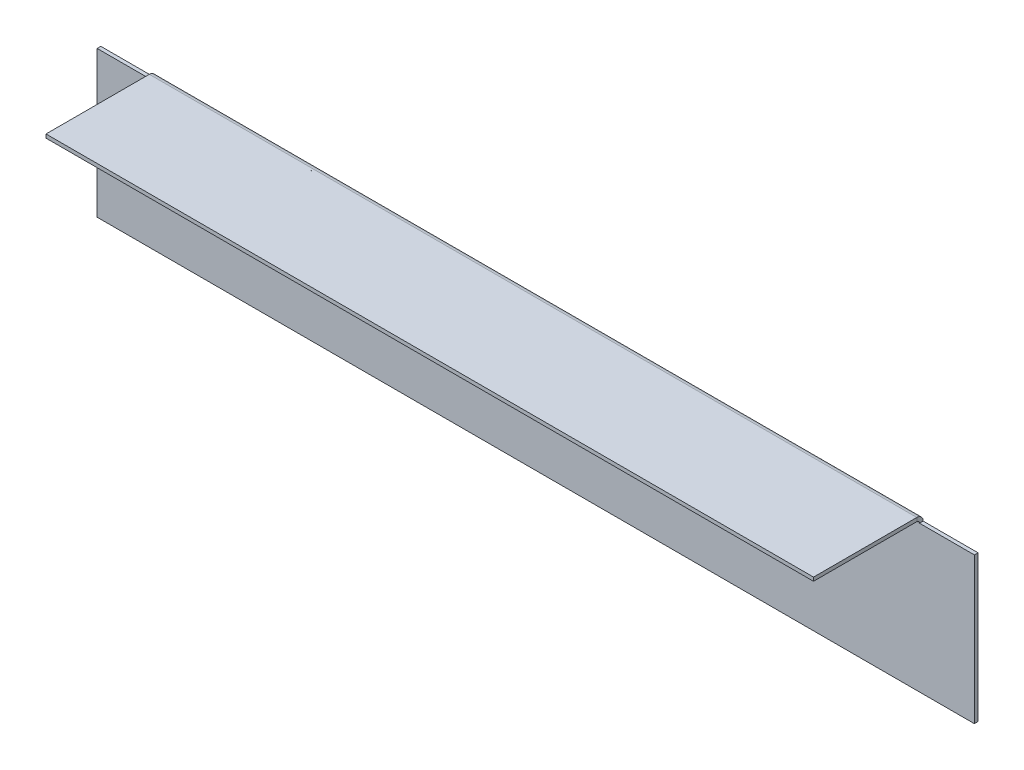
ISO-10303-21;
HEADER;
FILE_DESCRIPTION(('STEP AP214'),'2;1');
FILE_NAME('part.step','',(''),(''),'','','');
FILE_SCHEMA(('AUTOMOTIVE_DESIGN { 1 0 10303 214 1 1 1 1 }'));
ENDSEC;
DATA;
#1=APPLICATION_CONTEXT('core data for automotive mechanical design processes');
#2=APPLICATION_PROTOCOL_DEFINITION('international standard','automotive_design',2000,#1);
#3=PRODUCT_CONTEXT('',#1,'mechanical');
#4=PRODUCT('Part','Part','',(#3));
#5=PRODUCT_RELATED_PRODUCT_CATEGORY('part','',(#4));
#6=PRODUCT_DEFINITION_FORMATION('','',#4);
#7=PRODUCT_DEFINITION_CONTEXT('part definition',#1,'design');
#8=PRODUCT_DEFINITION('design','',#6,#7);
#9=PRODUCT_DEFINITION_SHAPE('','',#8);
#10=(LENGTH_UNIT() NAMED_UNIT(*) SI_UNIT(.MILLI.,.METRE.));
#11=(NAMED_UNIT(*) PLANE_ANGLE_UNIT() SI_UNIT($,.RADIAN.));
#12=(NAMED_UNIT(*) SI_UNIT($,.STERADIAN.) SOLID_ANGLE_UNIT());
#13=UNCERTAINTY_MEASURE_WITH_UNIT(LENGTH_MEASURE(1.E-05),#10,'distance_accuracy_value','');
#14=(GEOMETRIC_REPRESENTATION_CONTEXT(3) GLOBAL_UNCERTAINTY_ASSIGNED_CONTEXT((#13)) GLOBAL_UNIT_ASSIGNED_CONTEXT((#10,
#11,#12)) REPRESENTATION_CONTEXT('',''));
#15=CARTESIAN_POINT('',(0.,0.,0.));
#16=DIRECTION('',(0.,0.,1.));
#17=DIRECTION('',(1.,0.,0.));
#18=AXIS2_PLACEMENT_3D('',#15,#16,#17);
#19=CARTESIAN_POINT('',(-120.,20.,-1.));
#20=DIRECTION('',(0.,1.,0.));
#21=DIRECTION('',(0.,0.,1.));
#22=AXIS2_PLACEMENT_3D('',#19,#20,#21);
#23=PLANE('',#22);
#24=DIRECTION('',(-1.,0.,0.));
#25=VECTOR('',#24,1.);
#26=CARTESIAN_POINT('',(-120.,20.,0.));
#27=LINE('',#26,#25);
#28=CARTESIAN_POINT('',(-105.,20.,0.));
#29=VERTEX_POINT('',#28);
#30=CARTESIAN_POINT('',(-120.,20.,0.));
#31=VERTEX_POINT('',#30);
#32=EDGE_CURVE('E240',#29,#31,#27,.T.);
#33=ORIENTED_EDGE('',*,*,#32,.F.);
#34=DIRECTION('',(0.,0.,-1.));
#35=VECTOR('',#34,1.);
#36=CARTESIAN_POINT('',(-105.,20.,0.));
#37=LINE('',#36,#35);
#38=CARTESIAN_POINT('',(-105.,20.,-1.));
#39=VERTEX_POINT('',#38);
#40=EDGE_CURVE('E203',#29,#39,#37,.T.);
#41=ORIENTED_EDGE('',*,*,#40,.T.);
#42=DIRECTION('',(-1.,0.,0.));
#43=VECTOR('',#42,1.);
#44=CARTESIAN_POINT('',(-120.,20.,-1.));
#45=LINE('',#44,#43);
#46=CARTESIAN_POINT('',(-120.,20.,-1.));
#47=VERTEX_POINT('',#46);
#48=EDGE_CURVE('E271',#39,#47,#45,.T.);
#49=ORIENTED_EDGE('',*,*,#48,.T.);
#50=DIRECTION('',(0.,0.,1.));
#51=VECTOR('',#50,1.);
#52=CARTESIAN_POINT('',(-120.,20.,-1.));
#53=LINE('',#52,#51);
#54=EDGE_CURVE('E257',#47,#31,#53,.T.);
#55=ORIENTED_EDGE('',*,*,#54,.T.);
#56=EDGE_LOOP('',(#33,#41,#49,#55));
#57=FACE_BOUND('',#56,.T.);
#58=ADVANCED_FACE('F57',(#57),#23,.T.);
#59=CARTESIAN_POINT('',(120.,-20.,-1.));
#60=DIRECTION('',(1.,0.,0.));
#61=DIRECTION('',(0.,0.,-1.));
#62=AXIS2_PLACEMENT_3D('',#59,#60,#61);
#63=PLANE('',#62);
#64=DIRECTION('',(0.,1.,0.));
#65=VECTOR('',#64,1.);
#66=CARTESIAN_POINT('',(120.,-20.,0.));
#67=LINE('',#66,#65);
#68=CARTESIAN_POINT('',(120.,-20.,0.));
#69=VERTEX_POINT('',#68);
#70=CARTESIAN_POINT('',(120.,20.,0.));
#71=VERTEX_POINT('',#70);
#72=EDGE_CURVE('E202',#69,#71,#67,.T.);
#73=ORIENTED_EDGE('',*,*,#72,.F.);
#74=DIRECTION('',(0.,0.,1.));
#75=VECTOR('',#74,1.);
#76=CARTESIAN_POINT('',(120.,-20.,-1.));
#77=LINE('',#76,#75);
#78=CARTESIAN_POINT('',(120.,-20.,-1.));
#79=VERTEX_POINT('',#78);
#80=EDGE_CURVE('E13',#79,#69,#77,.T.);
#81=ORIENTED_EDGE('',*,*,#80,.F.);
#82=DIRECTION('',(0.,1.,0.));
#83=VECTOR('',#82,1.);
#84=CARTESIAN_POINT('',(120.,-20.,-1.));
#85=LINE('',#84,#83);
#86=CARTESIAN_POINT('',(120.,20.,-1.));
#87=VERTEX_POINT('',#86);
#88=EDGE_CURVE('E255',#79,#87,#85,.T.);
#89=ORIENTED_EDGE('',*,*,#88,.T.);
#90=DIRECTION('',(0.,0.,1.));
#91=VECTOR('',#90,1.);
#92=CARTESIAN_POINT('',(120.,20.,-1.));
#93=LINE('',#92,#91);
#94=EDGE_CURVE('E107',#87,#71,#93,.T.);
#95=ORIENTED_EDGE('',*,*,#94,.T.);
#96=EDGE_LOOP('',(#73,#81,#89,#95));
#97=FACE_BOUND('',#96,.T.);
#98=ADVANCED_FACE('F59',(#97),#63,.T.);
#99=CARTESIAN_POINT('',(-120.,-20.,-1.));
#100=DIRECTION('',(0.,-1.,0.));
#101=DIRECTION('',(0.,0.,-1.));
#102=AXIS2_PLACEMENT_3D('',#99,#100,#101);
#103=PLANE('',#102);
#104=DIRECTION('',(1.,0.,0.));
#105=VECTOR('',#104,1.);
#106=CARTESIAN_POINT('',(-120.,-20.,0.));
#107=LINE('',#106,#105);
#108=CARTESIAN_POINT('',(-120.,-20.,0.));
#109=VERTEX_POINT('',#108);
#110=EDGE_CURVE('E243',#109,#69,#107,.T.);
#111=ORIENTED_EDGE('',*,*,#110,.F.);
#112=DIRECTION('',(0.,0.,1.));
#113=VECTOR('',#112,1.);
#114=CARTESIAN_POINT('',(-120.,-20.,-1.));
#115=LINE('',#114,#113);
#116=CARTESIAN_POINT('',(-120.,-20.,-1.));
#117=VERTEX_POINT('',#116);
#118=EDGE_CURVE('E66',#117,#109,#115,.T.);
#119=ORIENTED_EDGE('',*,*,#118,.F.);
#120=DIRECTION('',(1.,0.,0.));
#121=VECTOR('',#120,1.);
#122=CARTESIAN_POINT('',(-120.,-20.,-1.));
#123=LINE('',#122,#121);
#124=EDGE_CURVE('E262',#117,#79,#123,.T.);
#125=ORIENTED_EDGE('',*,*,#124,.T.);
#126=ORIENTED_EDGE('',*,*,#80,.T.);
#127=EDGE_LOOP('',(#111,#119,#125,#126));
#128=FACE_BOUND('',#127,.T.);
#129=ADVANCED_FACE('F276',(#128),#103,.T.);
#130=CARTESIAN_POINT('',(-120.,-20.,-1.));
#131=DIRECTION('',(-1.,0.,0.));
#132=DIRECTION('',(0.,0.,1.));
#133=AXIS2_PLACEMENT_3D('',#130,#131,#132);
#134=PLANE('',#133);
#135=DIRECTION('',(0.,-1.,0.));
#136=VECTOR('',#135,1.);
#137=CARTESIAN_POINT('',(-120.,-20.,0.));
#138=LINE('',#137,#136);
#139=EDGE_CURVE('E239',#31,#109,#138,.T.);
#140=ORIENTED_EDGE('',*,*,#139,.F.);
#141=ORIENTED_EDGE('',*,*,#54,.F.);
#142=DIRECTION('',(0.,-1.,0.));
#143=VECTOR('',#142,1.);
#144=CARTESIAN_POINT('',(-120.,-20.,-1.));
#145=LINE('',#144,#143);
#146=EDGE_CURVE('E263',#47,#117,#145,.T.);
#147=ORIENTED_EDGE('',*,*,#146,.T.);
#148=ORIENTED_EDGE('',*,*,#118,.T.);
#149=EDGE_LOOP('',(#140,#141,#147,#148));
#150=FACE_BOUND('',#149,.T.);
#151=ADVANCED_FACE('F275',(#150),#134,.T.);
#152=DIRECTION('',(0.,0.,-1.));
#153=VECTOR('',#152,1.);
#154=CARTESIAN_POINT('',(105.,20.,0.));
#155=LINE('',#154,#153);
#156=CARTESIAN_POINT('',(105.,20.,0.));
#157=VERTEX_POINT('',#156);
#158=CARTESIAN_POINT('',(105.,20.,-1.));
#159=VERTEX_POINT('',#158);
#160=EDGE_CURVE('E199',#157,#159,#155,.T.);
#161=ORIENTED_EDGE('',*,*,#160,.F.);
#162=EDGE_CURVE('E234',#71,#157,#27,.T.);
#163=ORIENTED_EDGE('',*,*,#162,.F.);
#164=ORIENTED_EDGE('',*,*,#94,.F.);
#165=EDGE_CURVE('E236',#87,#159,#45,.T.);
#166=ORIENTED_EDGE('',*,*,#165,.T.);
#167=EDGE_LOOP('',(#161,#163,#164,#166));
#168=FACE_BOUND('',#167,.T.);
#169=ADVANCED_FACE('F233',(#168),#23,.T.);
#170=CARTESIAN_POINT('',(0.,0.,-1.));
#171=DIRECTION('',(0.,0.,-1.));
#172=DIRECTION('',(-1.,0.,0.));
#173=AXIS2_PLACEMENT_3D('',#170,#171,#172);
#174=PLANE('',#173);
#175=ORIENTED_EDGE('',*,*,#88,.F.);
#176=ORIENTED_EDGE('',*,*,#124,.F.);
#177=ORIENTED_EDGE('',*,*,#146,.F.);
#178=ORIENTED_EDGE('',*,*,#48,.F.);
#179=DIRECTION('',(-1.,0.,0.));
#180=VECTOR('',#179,1.);
#181=CARTESIAN_POINT('',(-105.,20.,-1.00000000000005));
#182=LINE('',#181,#180);
#183=EDGE_CURVE('E147',#39,#159,#182,.F.);
#184=ORIENTED_EDGE('',*,*,#183,.T.);
#185=ORIENTED_EDGE('',*,*,#165,.F.);
#186=EDGE_LOOP('',(#175,#176,#177,#178,#184,#185));
#187=FACE_BOUND('',#186,.T.);
#188=ADVANCED_FACE('F272',(#187),#174,.T.);
#189=CARTESIAN_POINT('',(0.,0.,0.));
#190=DIRECTION('',(0.,0.,-1.));
#191=DIRECTION('',(-1.,0.,0.));
#192=AXIS2_PLACEMENT_3D('',#189,#190,#191);
#193=PLANE('',#192);
#194=ORIENTED_EDGE('',*,*,#72,.T.);
#195=ORIENTED_EDGE('',*,*,#162,.T.);
#196=DIRECTION('',(-1.,0.,0.));
#197=VECTOR('',#196,1.);
#198=CARTESIAN_POINT('',(-105.,20.,0.));
#199=LINE('',#198,#197);
#200=EDGE_CURVE('E208',#29,#157,#199,.F.);
#201=ORIENTED_EDGE('',*,*,#200,.F.);
#202=ORIENTED_EDGE('',*,*,#32,.T.);
#203=ORIENTED_EDGE('',*,*,#139,.T.);
#204=ORIENTED_EDGE('',*,*,#110,.T.);
#205=EDGE_LOOP('',(#194,#195,#201,#202,#203,#204));
#206=FACE_BOUND('',#205,.T.);
#207=ADVANCED_FACE('F237',(#206),#193,.F.);
#208=CARTESIAN_POINT('',(105.,20.,0.7366));
#209=DIRECTION('',(1.,0.,0.));
#210=DIRECTION('',(0.,0.,-1.));
#211=AXIS2_PLACEMENT_3D('',#208,#209,#210);
#212=PLANE('',#211);
#213=DIRECTION('',(0.,1.,0.));
#214=VECTOR('',#213,1.);
#215=CARTESIAN_POINT('',(105.,21.7366,0.73659999999999));
#216=LINE('',#215,#214);
#217=CARTESIAN_POINT('',(105.,20.7366,0.736599999999998));
#218=VERTEX_POINT('',#217);
#219=CARTESIAN_POINT('',(105.,21.7366,0.736599999999994));
#220=VERTEX_POINT('',#219);
#221=EDGE_CURVE('E191',#218,#220,#216,.T.);
#222=ORIENTED_EDGE('',*,*,#221,.F.);
#223=CARTESIAN_POINT('',(105.,20.,0.7366));
#224=DIRECTION('',(-1.,0.,0.));
#225=DIRECTION('',(0.,0.,1.));
#226=AXIS2_PLACEMENT_3D('',#223,#224,#225);
#227=CIRCLE('',#226,0.7366);
#228=EDGE_CURVE('E149',#157,#218,#227,.F.);
#229=ORIENTED_EDGE('',*,*,#228,.F.);
#230=ORIENTED_EDGE('',*,*,#160,.T.);
#231=CARTESIAN_POINT('',(105.,20.,0.7366));
#232=DIRECTION('',(-1.,0.,0.));
#233=DIRECTION('',(0.,0.,1.));
#234=AXIS2_PLACEMENT_3D('',#231,#232,#233);
#235=CIRCLE('',#234,1.7366);
#236=EDGE_CURVE('E210',#159,#220,#235,.F.);
#237=ORIENTED_EDGE('',*,*,#236,.T.);
#238=EDGE_LOOP('',(#222,#229,#230,#237));
#239=FACE_BOUND('',#238,.T.);
#240=ADVANCED_FACE('F232',(#239),#212,.T.);
#241=CARTESIAN_POINT('',(-105.,20.,0.736599999999954));
#242=DIRECTION('',(1.,0.,0.));
#243=DIRECTION('',(0.,0.,-1.));
#244=AXIS2_PLACEMENT_3D('',#241,#242,#243);
#245=PLANE('',#244);
#246=CARTESIAN_POINT('',(-105.,20.,0.736599999999954));
#247=DIRECTION('',(-1.,0.,0.));
#248=DIRECTION('',(0.,0.,1.));
#249=AXIS2_PLACEMENT_3D('',#246,#247,#248);
#250=CIRCLE('',#249,0.7366);
#251=CARTESIAN_POINT('',(-105.,20.7366,0.736599999999951));
#252=VERTEX_POINT('',#251);
#253=EDGE_CURVE('E156',#252,#29,#250,.T.);
#254=ORIENTED_EDGE('',*,*,#253,.F.);
#255=DIRECTION('',(0.,1.,0.));
#256=VECTOR('',#255,1.);
#257=CARTESIAN_POINT('',(-105.,20.7366,0.736599999999955));
#258=LINE('',#257,#256);
#259=CARTESIAN_POINT('',(-105.,21.7366,0.736599999999952));
#260=VERTEX_POINT('',#259);
#261=EDGE_CURVE('E153',#252,#260,#258,.T.);
#262=ORIENTED_EDGE('',*,*,#261,.T.);
#263=CARTESIAN_POINT('',(-105.,20.,0.736599999999954));
#264=DIRECTION('',(-1.,0.,0.));
#265=DIRECTION('',(0.,0.,1.));
#266=AXIS2_PLACEMENT_3D('',#263,#264,#265);
#267=CIRCLE('',#266,1.7366);
#268=EDGE_CURVE('E74',#260,#39,#267,.T.);
#269=ORIENTED_EDGE('',*,*,#268,.T.);
#270=ORIENTED_EDGE('',*,*,#40,.F.);
#271=EDGE_LOOP('',(#254,#262,#269,#270));
#272=FACE_BOUND('',#271,.T.);
#273=ADVANCED_FACE('F154',(#272),#245,.F.);
#274=CARTESIAN_POINT('',(-105.,20.,0.736599999999954));
#275=DIRECTION('',(-1.,0.,0.));
#276=DIRECTION('',(0.,1.,0.));
#277=AXIS2_PLACEMENT_3D('',#274,#275,#276);
#278=CYLINDRICAL_SURFACE('',#277,1.7366);
#279=ORIENTED_EDGE('',*,*,#183,.F.);
#280=ORIENTED_EDGE('',*,*,#268,.F.);
#281=DIRECTION('',(-1.,0.,0.));
#282=VECTOR('',#281,1.);
#283=CARTESIAN_POINT('',(0.,21.7366,0.736599999999971));
#284=LINE('',#283,#282);
#285=EDGE_CURVE('E144',#220,#260,#284,.T.);
#286=ORIENTED_EDGE('',*,*,#285,.F.);
#287=ORIENTED_EDGE('',*,*,#236,.F.);
#288=EDGE_LOOP('',(#279,#280,#286,#287));
#289=FACE_BOUND('',#288,.T.);
#290=ADVANCED_FACE('F141',(#289),#278,.T.);
#291=CARTESIAN_POINT('',(-105.,20.,0.736599999999954));
#292=DIRECTION('',(-1.,0.,0.));
#293=DIRECTION('',(0.,1.,0.));
#294=AXIS2_PLACEMENT_3D('',#291,#292,#293);
#295=CYLINDRICAL_SURFACE('',#294,0.7366);
#296=ORIENTED_EDGE('',*,*,#200,.T.);
#297=ORIENTED_EDGE('',*,*,#228,.T.);
#298=DIRECTION('',(1.,0.,0.));
#299=VECTOR('',#298,1.);
#300=CARTESIAN_POINT('',(105.,20.7366,0.736599999999993));
#301=LINE('',#300,#299);
#302=EDGE_CURVE('E161',#218,#252,#301,.F.);
#303=ORIENTED_EDGE('',*,*,#302,.T.);
#304=ORIENTED_EDGE('',*,*,#253,.T.);
#305=EDGE_LOOP('',(#296,#297,#303,#304));
#306=FACE_BOUND('',#305,.T.);
#307=ADVANCED_FACE('F226',(#306),#295,.F.);
#308=CARTESIAN_POINT('',(-105.,21.7366,0.));
#309=DIRECTION('',(-1.,0.,0.));
#310=DIRECTION('',(0.,0.,1.));
#311=AXIS2_PLACEMENT_3D('',#308,#309,#310);
#312=PLANE('',#311);
#313=DIRECTION('',(0.,0.,-1.));
#314=VECTOR('',#313,1.);
#315=CARTESIAN_POINT('',(-105.,21.7366,0.));
#316=LINE('',#315,#314);
#317=CARTESIAN_POINT('',(-105.,21.7366000000001,29.));
#318=VERTEX_POINT('',#317);
#319=EDGE_CURVE('E168',#318,#260,#316,.T.);
#320=ORIENTED_EDGE('',*,*,#319,.T.);
#321=ORIENTED_EDGE('',*,*,#261,.F.);
#322=DIRECTION('',(0.,0.,1.));
#323=VECTOR('',#322,1.);
#324=CARTESIAN_POINT('',(-105.,20.7366,-1.19636101791504E-13));
#325=LINE('',#324,#323);
#326=CARTESIAN_POINT('',(-105.,20.7366000000001,29.));
#327=VERTEX_POINT('',#326);
#328=EDGE_CURVE('E184',#327,#252,#325,.F.);
#329=ORIENTED_EDGE('',*,*,#328,.F.);
#330=DIRECTION('',(0.,-1.,0.));
#331=VECTOR('',#330,1.);
#332=CARTESIAN_POINT('',(-105.,21.7366000000001,29.));
#333=LINE('',#332,#331);
#334=EDGE_CURVE('E173',#318,#327,#333,.T.);
#335=ORIENTED_EDGE('',*,*,#334,.F.);
#336=EDGE_LOOP('',(#320,#321,#329,#335));
#337=FACE_BOUND('',#336,.T.);
#338=ADVANCED_FACE('F172',(#337),#312,.T.);
#339=CARTESIAN_POINT('',(105.,21.7366000000001,29.));
#340=DIRECTION('',(1.,0.,0.));
#341=DIRECTION('',(0.,0.,-1.));
#342=AXIS2_PLACEMENT_3D('',#339,#340,#341);
#343=PLANE('',#342);
#344=DIRECTION('',(0.,0.,-1.));
#345=VECTOR('',#344,1.);
#346=CARTESIAN_POINT('',(105.,20.7366,0.));
#347=LINE('',#346,#345);
#348=CARTESIAN_POINT('',(105.,20.7366000000001,29.));
#349=VERTEX_POINT('',#348);
#350=EDGE_CURVE('E170',#218,#349,#347,.F.);
#351=ORIENTED_EDGE('',*,*,#350,.F.);
#352=ORIENTED_EDGE('',*,*,#221,.T.);
#353=DIRECTION('',(0.,0.,1.));
#354=VECTOR('',#353,1.);
#355=CARTESIAN_POINT('',(105.,21.7366000000001,29.));
#356=LINE('',#355,#354);
#357=CARTESIAN_POINT('',(105.,21.7366000000001,29.));
#358=VERTEX_POINT('',#357);
#359=EDGE_CURVE('E169',#220,#358,#356,.T.);
#360=ORIENTED_EDGE('',*,*,#359,.T.);
#361=DIRECTION('',(0.,-1.,0.));
#362=VECTOR('',#361,1.);
#363=CARTESIAN_POINT('',(105.,21.7366000000001,29.));
#364=LINE('',#363,#362);
#365=EDGE_CURVE('E175',#358,#349,#364,.T.);
#366=ORIENTED_EDGE('',*,*,#365,.T.);
#367=EDGE_LOOP('',(#351,#352,#360,#366));
#368=FACE_BOUND('',#367,.T.);
#369=ADVANCED_FACE('F305',(#368),#343,.T.);
#370=CARTESIAN_POINT('',(0.,21.7366,0.));
#371=DIRECTION('',(0.,1.,0.));
#372=DIRECTION('',(0.,0.,1.));
#373=AXIS2_PLACEMENT_3D('',#370,#371,#372);
#374=PLANE('',#373);
#375=ORIENTED_EDGE('',*,*,#359,.F.);
#376=ORIENTED_EDGE('',*,*,#285,.T.);
#377=ORIENTED_EDGE('',*,*,#319,.F.);
#378=DIRECTION('',(-1.,0.,0.));
#379=VECTOR('',#378,1.);
#380=CARTESIAN_POINT('',(-105.,21.7366000000001,29.));
#381=LINE('',#380,#379);
#382=EDGE_CURVE('E176',#358,#318,#381,.T.);
#383=ORIENTED_EDGE('',*,*,#382,.F.);
#384=EDGE_LOOP('',(#375,#376,#377,#383));
#385=FACE_BOUND('',#384,.T.);
#386=ADVANCED_FACE('F166',(#385),#374,.T.);
#387=CARTESIAN_POINT('',(0.,20.7366,0.));
#388=DIRECTION('',(0.,1.,0.));
#389=DIRECTION('',(0.,0.,1.));
#390=AXIS2_PLACEMENT_3D('',#387,#388,#389);
#391=PLANE('',#390);
#392=ORIENTED_EDGE('',*,*,#302,.F.);
#393=ORIENTED_EDGE('',*,*,#350,.T.);
#394=DIRECTION('',(1.,0.,0.));
#395=VECTOR('',#394,1.);
#396=CARTESIAN_POINT('',(0.,20.7366000000001,29.));
#397=LINE('',#396,#395);
#398=EDGE_CURVE('E186',#349,#327,#397,.F.);
#399=ORIENTED_EDGE('',*,*,#398,.T.);
#400=ORIENTED_EDGE('',*,*,#328,.T.);
#401=EDGE_LOOP('',(#392,#393,#399,#400));
#402=FACE_BOUND('',#401,.T.);
#403=ADVANCED_FACE('F312',(#402),#391,.F.);
#404=CARTESIAN_POINT('',(-105.,21.7366000000001,29.));
#405=DIRECTION('',(0.,0.,1.));
#406=DIRECTION('',(0.,-1.,0.));
#407=AXIS2_PLACEMENT_3D('',#404,#405,#406);
#408=PLANE('',#407);
#409=ORIENTED_EDGE('',*,*,#398,.F.);
#410=ORIENTED_EDGE('',*,*,#365,.F.);
#411=ORIENTED_EDGE('',*,*,#382,.T.);
#412=ORIENTED_EDGE('',*,*,#334,.T.);
#413=EDGE_LOOP('',(#409,#410,#411,#412));
#414=FACE_BOUND('',#413,.T.);
#415=ADVANCED_FACE('F309',(#414),#408,.T.);
#416=CLOSED_SHELL('',(#58,#98,#129,#151,#169,#188,#207,#240,#273,#290,#307,#338,#369,#386,#403,#415));
#417=MANIFOLD_SOLID_BREP('B2',#416);
#418=ADVANCED_BREP_SHAPE_REPRESENTATION('',(#18,#417),#14);
#419=SHAPE_DEFINITION_REPRESENTATION(#9,#418);
ENDSEC;
END-ISO-10303-21;
